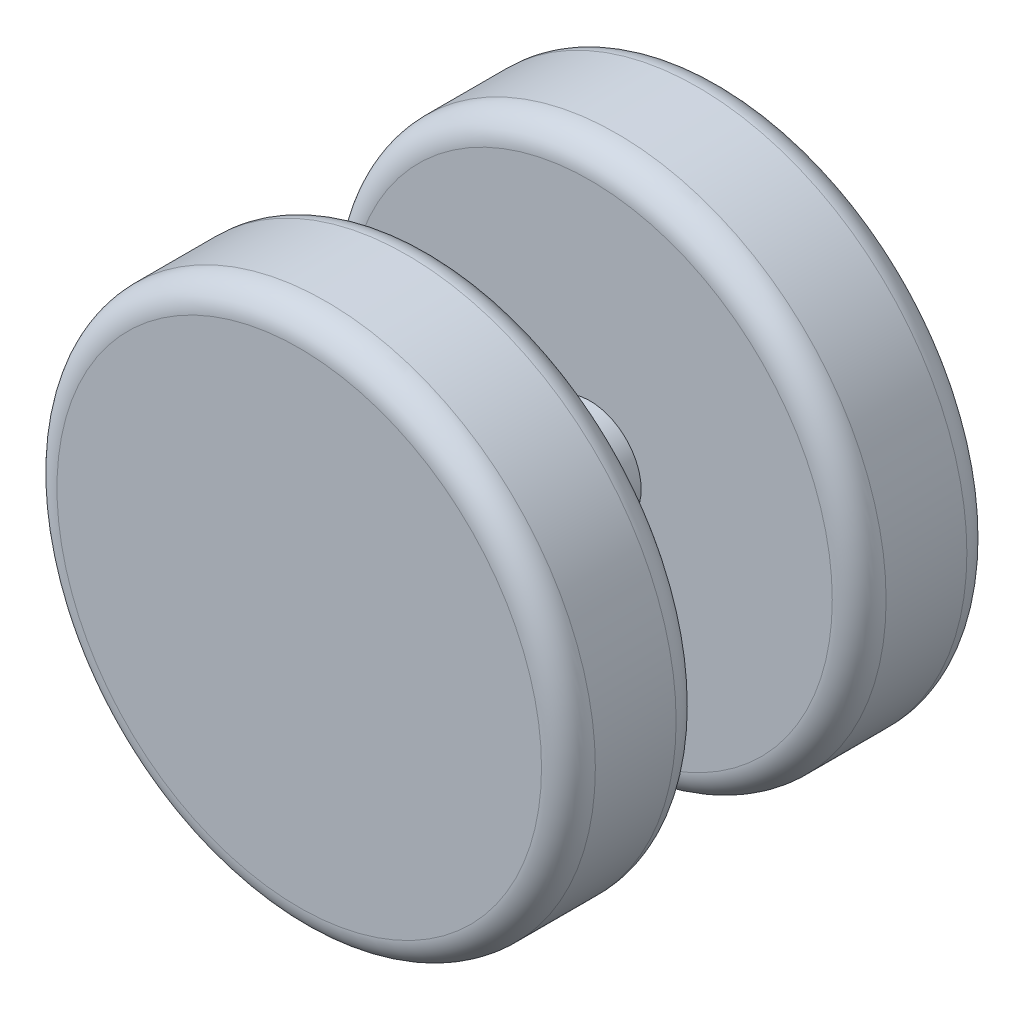
ISO-10303-21;
HEADER;
FILE_DESCRIPTION(('STEP AP214'),'2;1');
FILE_NAME('part.step','',(''),(''),'','','');
FILE_SCHEMA(('AUTOMOTIVE_DESIGN { 1 0 10303 214 1 1 1 1 }'));
ENDSEC;
DATA;
#1=APPLICATION_CONTEXT('core data for automotive mechanical design processes');
#2=APPLICATION_PROTOCOL_DEFINITION('international standard','automotive_design',2000,#1);
#3=PRODUCT_CONTEXT('',#1,'mechanical');
#4=PRODUCT('Part','Part','',(#3));
#5=PRODUCT_RELATED_PRODUCT_CATEGORY('part','',(#4));
#6=PRODUCT_DEFINITION_FORMATION('','',#4);
#7=PRODUCT_DEFINITION_CONTEXT('part definition',#1,'design');
#8=PRODUCT_DEFINITION('design','',#6,#7);
#9=PRODUCT_DEFINITION_SHAPE('','',#8);
#10=(LENGTH_UNIT() NAMED_UNIT(*) SI_UNIT(.MILLI.,.METRE.));
#11=(NAMED_UNIT(*) PLANE_ANGLE_UNIT() SI_UNIT($,.RADIAN.));
#12=(NAMED_UNIT(*) SI_UNIT($,.STERADIAN.) SOLID_ANGLE_UNIT());
#13=UNCERTAINTY_MEASURE_WITH_UNIT(LENGTH_MEASURE(1.E-05),#10,'distance_accuracy_value','');
#14=(GEOMETRIC_REPRESENTATION_CONTEXT(3) GLOBAL_UNCERTAINTY_ASSIGNED_CONTEXT((#13)) GLOBAL_UNIT_ASSIGNED_CONTEXT((#10,
#11,#12)) REPRESENTATION_CONTEXT('',''));
#15=CARTESIAN_POINT('',(0.,0.,0.));
#16=DIRECTION('',(0.,0.,1.));
#17=DIRECTION('',(1.,0.,0.));
#18=AXIS2_PLACEMENT_3D('',#15,#16,#17);
#19=CARTESIAN_POINT('',(0.,0.,2.5));
#20=DIRECTION('',(0.,0.,-1.));
#21=DIRECTION('',(-1.,0.,0.));
#22=AXIS2_PLACEMENT_3D('',#19,#20,#21);
#23=CYLINDRICAL_SURFACE('',#22,5.);
#24=CARTESIAN_POINT('',(0.,0.,2.));
#25=DIRECTION('',(0.,0.,1.));
#26=DIRECTION('',(1.,0.,0.));
#27=AXIS2_PLACEMENT_3D('',#24,#25,#26);
#28=CIRCLE('',#27,5.);
#29=CARTESIAN_POINT('',(5.,0.,2.));
#30=VERTEX_POINT('',#29);
#31=EDGE_CURVE('E52',#30,#30,#28,.F.);
#32=ORIENTED_EDGE('',*,*,#31,.T.);
#33=EDGE_LOOP('',(#32));
#34=FACE_BOUND('',#33,.T.);
#35=CARTESIAN_POINT('',(0.,0.,0.5));
#36=DIRECTION('',(0.,0.,1.));
#37=DIRECTION('',(1.,0.,0.));
#38=AXIS2_PLACEMENT_3D('',#35,#36,#37);
#39=CIRCLE('',#38,5.);
#40=CARTESIAN_POINT('',(5.,0.,0.5));
#41=VERTEX_POINT('',#40);
#42=EDGE_CURVE('E61',#41,#41,#39,.T.);
#43=ORIENTED_EDGE('',*,*,#42,.T.);
#44=EDGE_LOOP('',(#43));
#45=FACE_BOUND('',#44,.T.);
#46=ADVANCED_FACE('F32',(#34,#45),#23,.T.);
#47=CARTESIAN_POINT('',(0.,0.,2.5));
#48=DIRECTION('',(0.,0.,1.));
#49=DIRECTION('',(1.,0.,0.));
#50=AXIS2_PLACEMENT_3D('',#47,#48,#49);
#51=PLANE('',#50);
#52=CARTESIAN_POINT('',(0.,0.,2.5));
#53=DIRECTION('',(0.,0.,1.));
#54=DIRECTION('',(1.,0.,0.));
#55=AXIS2_PLACEMENT_3D('',#52,#53,#54);
#56=CIRCLE('',#55,0.95);
#57=CARTESIAN_POINT('',(0.95,0.,2.5));
#58=VERTEX_POINT('',#57);
#59=EDGE_CURVE('E65',#58,#58,#56,.T.);
#60=ORIENTED_EDGE('',*,*,#59,.F.);
#61=EDGE_LOOP('',(#60));
#62=FACE_BOUND('',#61,.T.);
#63=CARTESIAN_POINT('',(0.,0.,2.5));
#64=DIRECTION('',(0.,0.,1.));
#65=DIRECTION('',(1.,0.,0.));
#66=AXIS2_PLACEMENT_3D('',#63,#64,#65);
#67=CIRCLE('',#66,4.5);
#68=CARTESIAN_POINT('',(4.5,0.,2.5));
#69=VERTEX_POINT('',#68);
#70=EDGE_CURVE('E55',#69,#69,#67,.T.);
#71=ORIENTED_EDGE('',*,*,#70,.T.);
#72=EDGE_LOOP('',(#71));
#73=FACE_BOUND('',#72,.T.);
#74=ADVANCED_FACE('F81',(#62,#73),#51,.T.);
#75=CARTESIAN_POINT('',(0.,0.,0.));
#76=DIRECTION('',(0.,0.,1.));
#77=DIRECTION('',(1.,0.,0.));
#78=AXIS2_PLACEMENT_3D('',#75,#76,#77);
#79=PLANE('',#78);
#80=CARTESIAN_POINT('',(0.,0.,0.));
#81=DIRECTION('',(0.,0.,1.));
#82=DIRECTION('',(1.,0.,0.));
#83=AXIS2_PLACEMENT_3D('',#80,#81,#82);
#84=CIRCLE('',#83,4.5);
#85=CARTESIAN_POINT('',(4.5,0.,0.));
#86=VERTEX_POINT('',#85);
#87=EDGE_CURVE('E58',#86,#86,#84,.F.);
#88=ORIENTED_EDGE('',*,*,#87,.T.);
#89=EDGE_LOOP('',(#88));
#90=FACE_BOUND('',#89,.T.);
#91=ADVANCED_FACE('F84',(#90),#79,.F.);
#92=CARTESIAN_POINT('',(0.,0.,0.5));
#93=DIRECTION('',(0.,0.,1.));
#94=DIRECTION('',(1.,0.,0.));
#95=AXIS2_PLACEMENT_3D('',#92,#93,#94);
#96=TOROIDAL_SURFACE('',#95,4.5,0.5);
#97=ORIENTED_EDGE('',*,*,#87,.F.);
#98=EDGE_LOOP('',(#97));
#99=FACE_BOUND('',#98,.T.);
#100=ORIENTED_EDGE('',*,*,#42,.F.);
#101=EDGE_LOOP('',(#100));
#102=FACE_BOUND('',#101,.T.);
#103=ADVANCED_FACE('F89',(#99,#102),#96,.T.);
#104=CARTESIAN_POINT('',(0.,0.,2.));
#105=DIRECTION('',(0.,0.,1.));
#106=DIRECTION('',(1.,0.,0.));
#107=AXIS2_PLACEMENT_3D('',#104,#105,#106);
#108=TOROIDAL_SURFACE('',#107,4.5,0.5);
#109=ORIENTED_EDGE('',*,*,#31,.F.);
#110=EDGE_LOOP('',(#109));
#111=FACE_BOUND('',#110,.T.);
#112=ORIENTED_EDGE('',*,*,#70,.F.);
#113=EDGE_LOOP('',(#112));
#114=FACE_BOUND('',#113,.T.);
#115=ADVANCED_FACE('F77',(#111,#114),#108,.T.);
#116=CARTESIAN_POINT('',(0.,0.,5.4));
#117=DIRECTION('',(0.,0.,-1.));
#118=DIRECTION('',(-1.,0.,0.));
#119=AXIS2_PLACEMENT_3D('',#116,#117,#118);
#120=CYLINDRICAL_SURFACE('',#119,0.95);
#121=CARTESIAN_POINT('',(0.,0.,5.4));
#122=DIRECTION('',(0.,0.,1.));
#123=DIRECTION('',(1.,0.,0.));
#124=AXIS2_PLACEMENT_3D('',#121,#122,#123);
#125=CIRCLE('',#124,0.95);
#126=CARTESIAN_POINT('',(0.95,0.,5.4));
#127=VERTEX_POINT('',#126);
#128=EDGE_CURVE('E64',#127,#127,#125,.T.);
#129=ORIENTED_EDGE('',*,*,#128,.F.);
#130=EDGE_LOOP('',(#129));
#131=FACE_BOUND('',#130,.T.);
#132=ORIENTED_EDGE('',*,*,#59,.T.);
#133=EDGE_LOOP('',(#132));
#134=FACE_BOUND('',#133,.T.);
#135=ADVANCED_FACE('F73',(#131,#134),#120,.T.);
#136=CARTESIAN_POINT('',(0.,0.,7.9));
#137=DIRECTION('',(0.,0.,-1.));
#138=DIRECTION('',(-1.,0.,0.));
#139=AXIS2_PLACEMENT_3D('',#136,#137,#138);
#140=CYLINDRICAL_SURFACE('',#139,5.);
#141=CARTESIAN_POINT('',(0.,0.,5.9));
#142=DIRECTION('',(0.,0.,1.));
#143=DIRECTION('',(1.,0.,0.));
#144=AXIS2_PLACEMENT_3D('',#141,#142,#143);
#145=CIRCLE('',#144,5.);
#146=CARTESIAN_POINT('',(5.,0.,5.9));
#147=VERTEX_POINT('',#146);
#148=EDGE_CURVE('E43',#147,#147,#145,.T.);
#149=ORIENTED_EDGE('',*,*,#148,.T.);
#150=EDGE_LOOP('',(#149));
#151=FACE_BOUND('',#150,.T.);
#152=CARTESIAN_POINT('',(0.,0.,7.4));
#153=DIRECTION('',(0.,0.,1.));
#154=DIRECTION('',(1.,0.,0.));
#155=AXIS2_PLACEMENT_3D('',#152,#153,#154);
#156=CIRCLE('',#155,5.);
#157=CARTESIAN_POINT('',(5.,0.,7.4));
#158=VERTEX_POINT('',#157);
#159=EDGE_CURVE('E47',#158,#158,#156,.F.);
#160=ORIENTED_EDGE('',*,*,#159,.T.);
#161=EDGE_LOOP('',(#160));
#162=FACE_BOUND('',#161,.T.);
#163=ADVANCED_FACE('F76',(#151,#162),#140,.T.);
#164=CARTESIAN_POINT('',(0.,0.,7.9));
#165=DIRECTION('',(0.,0.,1.));
#166=DIRECTION('',(1.,0.,0.));
#167=AXIS2_PLACEMENT_3D('',#164,#165,#166);
#168=PLANE('',#167);
#169=CARTESIAN_POINT('',(0.,0.,7.9));
#170=DIRECTION('',(0.,0.,1.));
#171=DIRECTION('',(1.,0.,0.));
#172=AXIS2_PLACEMENT_3D('',#169,#170,#171);
#173=CIRCLE('',#172,4.5);
#174=CARTESIAN_POINT('',(4.5,0.,7.9));
#175=VERTEX_POINT('',#174);
#176=EDGE_CURVE('E10',#175,#175,#173,.T.);
#177=ORIENTED_EDGE('',*,*,#176,.T.);
#178=EDGE_LOOP('',(#177));
#179=FACE_BOUND('',#178,.T.);
#180=ADVANCED_FACE('F110',(#179),#168,.T.);
#181=CARTESIAN_POINT('',(0.,0.,5.4));
#182=DIRECTION('',(0.,0.,1.));
#183=DIRECTION('',(1.,0.,0.));
#184=AXIS2_PLACEMENT_3D('',#181,#182,#183);
#185=PLANE('',#184);
#186=CARTESIAN_POINT('',(0.,0.,5.4));
#187=DIRECTION('',(0.,0.,1.));
#188=DIRECTION('',(1.,0.,0.));
#189=AXIS2_PLACEMENT_3D('',#186,#187,#188);
#190=CIRCLE('',#189,4.5);
#191=CARTESIAN_POINT('',(4.5,0.,5.4));
#192=VERTEX_POINT('',#191);
#193=EDGE_CURVE('E39',#192,#192,#190,.F.);
#194=ORIENTED_EDGE('',*,*,#193,.T.);
#195=EDGE_LOOP('',(#194));
#196=FACE_BOUND('',#195,.T.);
#197=ORIENTED_EDGE('',*,*,#128,.T.);
#198=EDGE_LOOP('',(#197));
#199=FACE_BOUND('',#198,.T.);
#200=ADVANCED_FACE('F71',(#196,#199),#185,.F.);
#201=CARTESIAN_POINT('',(0.,0.,5.9));
#202=DIRECTION('',(0.,0.,1.));
#203=DIRECTION('',(1.,0.,0.));
#204=AXIS2_PLACEMENT_3D('',#201,#202,#203);
#205=TOROIDAL_SURFACE('',#204,4.5,0.5);
#206=ORIENTED_EDGE('',*,*,#193,.F.);
#207=EDGE_LOOP('',(#206));
#208=FACE_BOUND('',#207,.T.);
#209=ORIENTED_EDGE('',*,*,#148,.F.);
#210=EDGE_LOOP('',(#209));
#211=FACE_BOUND('',#210,.T.);
#212=ADVANCED_FACE('F114',(#208,#211),#205,.T.);
#213=CARTESIAN_POINT('',(0.,0.,7.4));
#214=DIRECTION('',(0.,0.,1.));
#215=DIRECTION('',(1.,0.,0.));
#216=AXIS2_PLACEMENT_3D('',#213,#214,#215);
#217=TOROIDAL_SURFACE('',#216,4.5,0.5);
#218=ORIENTED_EDGE('',*,*,#159,.F.);
#219=EDGE_LOOP('',(#218));
#220=FACE_BOUND('',#219,.T.);
#221=ORIENTED_EDGE('',*,*,#176,.F.);
#222=EDGE_LOOP('',(#221));
#223=FACE_BOUND('',#222,.T.);
#224=ADVANCED_FACE('F34',(#220,#223),#217,.T.);
#225=CLOSED_SHELL('',(#46,#74,#91,#103,#115,#135,#163,#180,#200,#212,#224));
#226=MANIFOLD_SOLID_BREP('B2',#225);
#227=ADVANCED_BREP_SHAPE_REPRESENTATION('',(#18,#226),#14);
#228=SHAPE_DEFINITION_REPRESENTATION(#9,#227);
ENDSEC;
END-ISO-10303-21;
